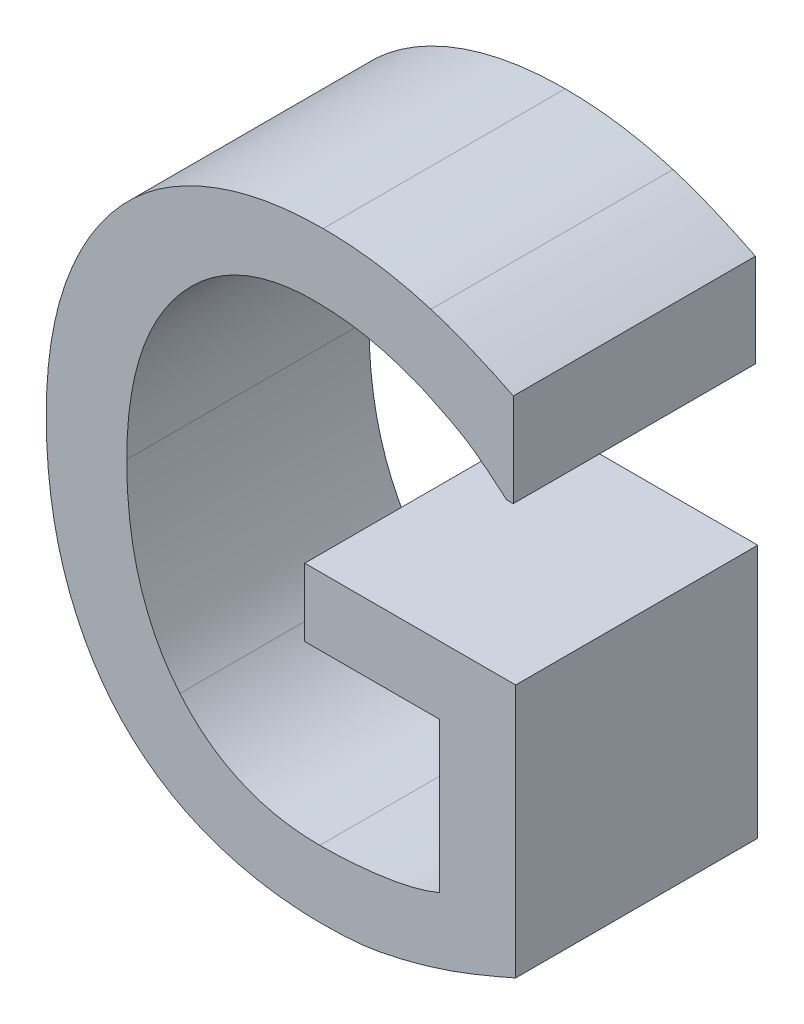
ISO-10303-21;
HEADER;
FILE_DESCRIPTION(('STEP AP214'),'2;1');
FILE_NAME('part.step','',(''),(''),'','','');
FILE_SCHEMA(('AUTOMOTIVE_DESIGN { 1 0 10303 214 1 1 1 1 }'));
ENDSEC;
DATA;
#1=APPLICATION_CONTEXT('core data for automotive mechanical design processes');
#2=APPLICATION_PROTOCOL_DEFINITION('international standard','automotive_design',2000,#1);
#3=PRODUCT_CONTEXT('',#1,'mechanical');
#4=PRODUCT('Part','Part','',(#3));
#5=PRODUCT_RELATED_PRODUCT_CATEGORY('part','',(#4));
#6=PRODUCT_DEFINITION_FORMATION('','',#4);
#7=PRODUCT_DEFINITION_CONTEXT('part definition',#1,'design');
#8=PRODUCT_DEFINITION('design','',#6,#7);
#9=PRODUCT_DEFINITION_SHAPE('','',#8);
#10=(LENGTH_UNIT() NAMED_UNIT(*) SI_UNIT(.MILLI.,.METRE.));
#11=(NAMED_UNIT(*) PLANE_ANGLE_UNIT() SI_UNIT($,.RADIAN.));
#12=(NAMED_UNIT(*) SI_UNIT($,.STERADIAN.) SOLID_ANGLE_UNIT());
#13=UNCERTAINTY_MEASURE_WITH_UNIT(LENGTH_MEASURE(1.E-05),#10,'distance_accuracy_value','');
#14=(GEOMETRIC_REPRESENTATION_CONTEXT(3) GLOBAL_UNCERTAINTY_ASSIGNED_CONTEXT((#13)) GLOBAL_UNIT_ASSIGNED_CONTEXT((#10,
#11,#12)) REPRESENTATION_CONTEXT('',''));
#15=CARTESIAN_POINT('',(0.,0.,0.));
#16=DIRECTION('',(0.,0.,1.));
#17=DIRECTION('',(1.,0.,0.));
#18=AXIS2_PLACEMENT_3D('',#15,#16,#17);
#19=CARTESIAN_POINT('',(-4.57632370667,-3.533902408114,0.));
#20=CARTESIAN_POINT('',(-4.57632370667,-3.533902408114,0.1));
#21=CARTESIAN_POINT('',(-4.57632370667,-3.564437254409,0.));
#22=CARTESIAN_POINT('',(-4.57632370667,-3.564437254409,0.1));
#23=CARTESIAN_POINT('',(-4.560181080921,-3.611503705385,0.));
#24=CARTESIAN_POINT('',(-4.560181080921,-3.611503705385,0.1));
#25=CARTESIAN_POINT('',(-4.545010902508,-3.627451841666,0.));
#26=CARTESIAN_POINT('',(-4.545010902508,-3.627451841666,0.1));
#27=B_SPLINE_SURFACE_WITH_KNOTS('',2,1,((#19,#20),(#21,#22),(#23,#24),(#25,#26)),.UNSPECIFIED.,
.F.,.F.,.F.,(3,1,3),(2,2),(-2.,-1.,0.),(0.,0.01),.UNSPECIFIED.);
#28=CARTESIAN_POINT('',(-4.545010902508,-3.627451841666,0.));
#29=CARTESIAN_POINT('',(-4.560181080921,-3.611503705385,0.));
#30=CARTESIAN_POINT('',(-4.57632370667,-3.564437254409,0.));
#31=CARTESIAN_POINT('',(-4.57632370667,-3.533902408114,0.));
#32=B_SPLINE_CURVE_WITH_KNOTS('',2,(#28,#29,#30,#31),.UNSPECIFIED.,.F.,.F.,(3,1,3),(0.,1.,2.),.UNSPECIFIED.);
#33=CARTESIAN_POINT('',(-4.545010902508,-3.627451841666,0.));
#34=VERTEX_POINT('',#33);
#35=CARTESIAN_POINT('',(-4.57632370667,-3.533902408114,0.));
#36=VERTEX_POINT('',#35);
#37=EDGE_CURVE('E11',#34,#36,#32,.T.);
#38=DIRECTION('',(0.,0.,1.));
#39=VECTOR('',#38,1.);
#40=CARTESIAN_POINT('',(-4.545010902508,-3.627451841666,0.));
#41=LINE('',#40,#39);
#42=CARTESIAN_POINT('',(-4.545010902508,-3.627451841666,0.1));
#43=VERTEX_POINT('',#42);
#44=EDGE_CURVE('E28',#34,#43,#41,.T.);
#45=CARTESIAN_POINT('',(-4.57632370667,-3.533902408114,0.1));
#46=CARTESIAN_POINT('',(-4.57632370667,-3.564437254409,0.1));
#47=CARTESIAN_POINT('',(-4.560181080921,-3.611503705385,0.1));
#48=CARTESIAN_POINT('',(-4.545010902508,-3.627451841666,0.1));
#49=B_SPLINE_CURVE_WITH_KNOTS('',2,(#45,#46,#47,#48),.UNSPECIFIED.,.F.,.F.,(3,1,3),(-2.,-1.,0.),.UNSPECIFIED.);
#50=CARTESIAN_POINT('',(-4.57632370667,-3.533902408114,0.1));
#51=VERTEX_POINT('',#50);
#52=EDGE_CURVE('E182',#51,#43,#49,.T.);
#53=DIRECTION('',(0.,0.,1.));
#54=VECTOR('',#53,1.);
#55=CARTESIAN_POINT('',(-4.57632370667,-3.533902408114,0.));
#56=LINE('',#55,#54);
#57=EDGE_CURVE('E454',#36,#51,#56,.T.);
#58=ORIENTED_EDGE('',*,*,#37,.F.);
#59=ORIENTED_EDGE('',*,*,#44,.T.);
#60=ORIENTED_EDGE('',*,*,#52,.F.);
#61=ORIENTED_EDGE('',*,*,#57,.F.);
#62=EDGE_LOOP('',(#58,#59,#60,#61));
#63=FACE_BOUND('',#62,.T.);
#64=ADVANCED_FACE('F17',(#63),#27,.T.);
#65=CARTESIAN_POINT('',(-4.544816413041,-3.442686848164,0.));
#66=CARTESIAN_POINT('',(-4.544816413041,-3.442686848164,0.1));
#67=CARTESIAN_POINT('',(-4.559986591455,-3.459023963379,0.));
#68=CARTESIAN_POINT('',(-4.559986591455,-3.459023963379,0.1));
#69=CARTESIAN_POINT('',(-4.57632370667,-3.504923477554,0.));
#70=CARTESIAN_POINT('',(-4.57632370667,-3.504923477554,0.1));
#71=CARTESIAN_POINT('',(-4.57632370667,-3.533902408114,0.));
#72=CARTESIAN_POINT('',(-4.57632370667,-3.533902408114,0.1));
#73=B_SPLINE_SURFACE_WITH_KNOTS('',2,1,((#65,#66),(#67,#68),(#69,#70),(#71,#72)),.UNSPECIFIED.,
.F.,.F.,.F.,(3,1,3),(2,2),(-2.,-1.,0.),(0.,0.01),.UNSPECIFIED.);
#74=CARTESIAN_POINT('',(-4.57632370667,-3.533902408114,0.));
#75=CARTESIAN_POINT('',(-4.57632370667,-3.504923477554,0.));
#76=CARTESIAN_POINT('',(-4.559986591455,-3.459023963379,0.));
#77=CARTESIAN_POINT('',(-4.544816413041,-3.442686848164,0.));
#78=B_SPLINE_CURVE_WITH_KNOTS('',2,(#74,#75,#76,#77),.UNSPECIFIED.,.F.,.F.,(3,1,3),(0.,1.,2.),.UNSPECIFIED.);
#79=CARTESIAN_POINT('',(-4.544816413041,-3.442686848164,0.));
#80=VERTEX_POINT('',#79);
#81=EDGE_CURVE('E447',#36,#80,#78,.T.);
#82=CARTESIAN_POINT('',(-4.544816413041,-3.442686848164,0.1));
#83=CARTESIAN_POINT('',(-4.559986591455,-3.459023963379,0.1));
#84=CARTESIAN_POINT('',(-4.57632370667,-3.504923477554,0.1));
#85=CARTESIAN_POINT('',(-4.57632370667,-3.533902408114,0.1));
#86=B_SPLINE_CURVE_WITH_KNOTS('',2,(#82,#83,#84,#85),.UNSPECIFIED.,.F.,.F.,(3,1,3),(-2.,-1.,0.),.UNSPECIFIED.);
#87=CARTESIAN_POINT('',(-4.544816413041,-3.442686848164,0.1));
#88=VERTEX_POINT('',#87);
#89=EDGE_CURVE('E443',#88,#51,#86,.T.);
#90=DIRECTION('',(0.,0.,1.));
#91=VECTOR('',#90,1.);
#92=CARTESIAN_POINT('',(-4.544816413041,-3.442686848164,0.));
#93=LINE('',#92,#91);
#94=EDGE_CURVE('E437',#80,#88,#93,.T.);
#95=ORIENTED_EDGE('',*,*,#81,.F.);
#96=ORIENTED_EDGE('',*,*,#57,.T.);
#97=ORIENTED_EDGE('',*,*,#89,.F.);
#98=ORIENTED_EDGE('',*,*,#94,.F.);
#99=EDGE_LOOP('',(#95,#96,#97,#98));
#100=FACE_BOUND('',#99,.T.);
#101=ADVANCED_FACE('F536',(#100),#73,.T.);
#102=CARTESIAN_POINT('',(-4.461963900165,-3.409818128267,0.));
#103=CARTESIAN_POINT('',(-4.461963900165,-3.409818128267,0.1));
#104=CARTESIAN_POINT('',(-4.487442020322,-3.409818128267,0.));
#105=CARTESIAN_POINT('',(-4.487442020322,-3.409818128267,0.1));
#106=CARTESIAN_POINT('',(-4.530229703027,-3.42693320135,0.));
#107=CARTESIAN_POINT('',(-4.530229703027,-3.42693320135,0.1));
#108=CARTESIAN_POINT('',(-4.544816413041,-3.442686848164,0.));
#109=CARTESIAN_POINT('',(-4.544816413041,-3.442686848164,0.1));
#110=B_SPLINE_SURFACE_WITH_KNOTS('',2,1,((#102,#103),(#104,#105),(#106,#107),(#108,#109)),
.UNSPECIFIED.,.F.,.F.,.F.,(3,1,3),(2,2),(-2.,-1.,0.),(0.,0.01),.UNSPECIFIED.);
#111=CARTESIAN_POINT('',(-4.544816413041,-3.442686848164,0.));
#112=CARTESIAN_POINT('',(-4.530229703027,-3.42693320135,0.));
#113=CARTESIAN_POINT('',(-4.487442020322,-3.409818128267,0.));
#114=CARTESIAN_POINT('',(-4.461963900165,-3.409818128267,0.));
#115=B_SPLINE_CURVE_WITH_KNOTS('',2,(#111,#112,#113,#114),.UNSPECIFIED.,.F.,.F.,(3,1,3),(0.,1.,
2.),.UNSPECIFIED.);
#116=CARTESIAN_POINT('',(-4.461963900165,-3.409818128267,0.));
#117=VERTEX_POINT('',#116);
#118=EDGE_CURVE('E430',#80,#117,#115,.T.);
#119=CARTESIAN_POINT('',(-4.461963900165,-3.409818128267,0.1));
#120=CARTESIAN_POINT('',(-4.487442020322,-3.409818128267,0.1));
#121=CARTESIAN_POINT('',(-4.530229703027,-3.42693320135,0.1));
#122=CARTESIAN_POINT('',(-4.544816413041,-3.442686848164,0.1));
#123=B_SPLINE_CURVE_WITH_KNOTS('',2,(#119,#120,#121,#122),.UNSPECIFIED.,.F.,.F.,(3,1,3),(-2.,
-1.,0.),.UNSPECIFIED.);
#124=CARTESIAN_POINT('',(-4.461963900165,-3.409818128267,0.1));
#125=VERTEX_POINT('',#124);
#126=EDGE_CURVE('E425',#125,#88,#123,.T.);
#127=DIRECTION('',(0.,0.,1.));
#128=VECTOR('',#127,1.);
#129=CARTESIAN_POINT('',(-4.461963900165,-3.409818128267,0.));
#130=LINE('',#129,#128);
#131=EDGE_CURVE('E419',#117,#125,#130,.T.);
#132=ORIENTED_EDGE('',*,*,#118,.F.);
#133=ORIENTED_EDGE('',*,*,#94,.T.);
#134=ORIENTED_EDGE('',*,*,#126,.F.);
#135=ORIENTED_EDGE('',*,*,#131,.F.);
#136=EDGE_LOOP('',(#132,#133,#134,#135));
#137=FACE_BOUND('',#136,.T.);
#138=ADVANCED_FACE('F532',(#137),#110,.T.);
#139=CARTESIAN_POINT('',(-4.417425812258,-3.41643077014,0.));
#140=CARTESIAN_POINT('',(-4.417425812258,-3.41643077014,0.1));
#141=CARTESIAN_POINT('',(-4.427539264533,-3.413318938671,0.));
#142=CARTESIAN_POINT('',(-4.427539264533,-3.413318938671,0.1));
#143=CARTESIAN_POINT('',(-4.449711063754,-3.409818128267,0.));
#144=CARTESIAN_POINT('',(-4.449711063754,-3.409818128267,0.1));
#145=CARTESIAN_POINT('',(-4.461963900165,-3.409818128267,0.));
#146=CARTESIAN_POINT('',(-4.461963900165,-3.409818128267,0.1));
#147=B_SPLINE_SURFACE_WITH_KNOTS('',2,1,((#139,#140),(#141,#142),(#143,#144),(#145,#146)),
.UNSPECIFIED.,.F.,.F.,.F.,(3,1,3),(2,2),(-2.,-1.,0.),(0.,0.01),.UNSPECIFIED.);
#148=CARTESIAN_POINT('',(-4.461963900165,-3.409818128267,0.));
#149=CARTESIAN_POINT('',(-4.449711063754,-3.409818128267,0.));
#150=CARTESIAN_POINT('',(-4.427539264533,-3.413318938671,0.));
#151=CARTESIAN_POINT('',(-4.417425812258,-3.41643077014,0.));
#152=B_SPLINE_CURVE_WITH_KNOTS('',2,(#148,#149,#150,#151),.UNSPECIFIED.,.F.,.F.,(3,1,3),(0.,1.,
2.),.UNSPECIFIED.);
#153=CARTESIAN_POINT('',(-4.417425812258,-3.41643077014,0.));
#154=VERTEX_POINT('',#153);
#155=EDGE_CURVE('E412',#117,#154,#152,.T.);
#156=CARTESIAN_POINT('',(-4.417425812258,-3.41643077014,0.1));
#157=CARTESIAN_POINT('',(-4.427539264533,-3.413318938671,0.1));
#158=CARTESIAN_POINT('',(-4.449711063754,-3.409818128267,0.1));
#159=CARTESIAN_POINT('',(-4.461963900165,-3.409818128267,0.1));
#160=B_SPLINE_CURVE_WITH_KNOTS('',2,(#156,#157,#158,#159),.UNSPECIFIED.,.F.,.F.,(3,1,3),(-2.,
-1.,0.),.UNSPECIFIED.);
#161=CARTESIAN_POINT('',(-4.417425812258,-3.41643077014,0.1));
#162=VERTEX_POINT('',#161);
#163=EDGE_CURVE('E407',#162,#125,#160,.T.);
#164=DIRECTION('',(0.,0.,1.));
#165=VECTOR('',#164,1.);
#166=CARTESIAN_POINT('',(-4.417425812258,-3.41643077014,0.));
#167=LINE('',#166,#165);
#168=EDGE_CURVE('E401',#154,#162,#167,.T.);
#169=ORIENTED_EDGE('',*,*,#155,.F.);
#170=ORIENTED_EDGE('',*,*,#131,.T.);
#171=ORIENTED_EDGE('',*,*,#163,.F.);
#172=ORIENTED_EDGE('',*,*,#168,.F.);
#173=EDGE_LOOP('',(#169,#170,#171,#172));
#174=FACE_BOUND('',#173,.T.);
#175=ADVANCED_FACE('F528',(#174),#147,.T.);
#176=CARTESIAN_POINT('',(-4.38339015556,-3.430434011753,0.));
#177=CARTESIAN_POINT('',(-4.38339015556,-3.430434011753,0.1));
#178=CARTESIAN_POINT('',(-4.389419329032,-3.427322180283,0.));
#179=CARTESIAN_POINT('',(-4.389419329032,-3.427322180283,0.1));
#180=CARTESIAN_POINT('',(-4.40925725465,-3.418764643742,0.));
#181=CARTESIAN_POINT('',(-4.40925725465,-3.418764643742,0.1));
#182=CARTESIAN_POINT('',(-4.417425812258,-3.41643077014,0.));
#183=CARTESIAN_POINT('',(-4.417425812258,-3.41643077014,0.1));
#184=B_SPLINE_SURFACE_WITH_KNOTS('',2,1,((#176,#177),(#178,#179),(#180,#181),(#182,#183)),
.UNSPECIFIED.,.F.,.F.,.F.,(3,1,3),(2,2),(-2.,-1.,0.),(0.,0.01),.UNSPECIFIED.);
#185=CARTESIAN_POINT('',(-4.417425812258,-3.41643077014,0.));
#186=CARTESIAN_POINT('',(-4.40925725465,-3.418764643742,0.));
#187=CARTESIAN_POINT('',(-4.389419329032,-3.427322180283,0.));
#188=CARTESIAN_POINT('',(-4.38339015556,-3.430434011753,0.));
#189=B_SPLINE_CURVE_WITH_KNOTS('',2,(#185,#186,#187,#188),.UNSPECIFIED.,.F.,.F.,(3,1,3),(0.,1.,
2.),.UNSPECIFIED.);
#190=CARTESIAN_POINT('',(-4.38339015556,-3.430434011753,0.));
#191=VERTEX_POINT('',#190);
#192=EDGE_CURVE('E394',#154,#191,#189,.T.);
#193=CARTESIAN_POINT('',(-4.38339015556,-3.430434011753,0.1));
#194=CARTESIAN_POINT('',(-4.389419329032,-3.427322180283,0.1));
#195=CARTESIAN_POINT('',(-4.40925725465,-3.418764643742,0.1));
#196=CARTESIAN_POINT('',(-4.417425812258,-3.41643077014,0.1));
#197=B_SPLINE_CURVE_WITH_KNOTS('',2,(#193,#194,#195,#196),.UNSPECIFIED.,.F.,.F.,(3,1,3),(-2.,
-1.,0.),.UNSPECIFIED.);
#198=CARTESIAN_POINT('',(-4.38339015556,-3.430434011753,0.1));
#199=VERTEX_POINT('',#198);
#200=EDGE_CURVE('E389',#199,#162,#197,.T.);
#201=DIRECTION('',(0.,0.,1.));
#202=VECTOR('',#201,1.);
#203=CARTESIAN_POINT('',(-4.38339015556,-3.430434011753,0.));
#204=LINE('',#203,#202);
#205=EDGE_CURVE('E386',#191,#199,#204,.T.);
#206=ORIENTED_EDGE('',*,*,#192,.F.);
#207=ORIENTED_EDGE('',*,*,#168,.T.);
#208=ORIENTED_EDGE('',*,*,#200,.F.);
#209=ORIENTED_EDGE('',*,*,#205,.F.);
#210=EDGE_LOOP('',(#206,#207,#208,#209));
#211=FACE_BOUND('',#210,.T.);
#212=ADVANCED_FACE('F524',(#211),#184,.T.);
#213=CARTESIAN_POINT('',(-4.38339015556,-3.468942926188,0.));
#214=DIRECTION('',(1.,0.,0.));
#215=DIRECTION('',(0.,1.,0.));
#216=AXIS2_PLACEMENT_3D('',#213,#214,#215);
#217=PLANE('',#216);
#218=DIRECTION('',(0.,-1.,0.));
#219=VECTOR('',#218,1.);
#220=CARTESIAN_POINT('',(-4.38339015556,-3.430434011753,0.));
#221=LINE('',#220,#219);
#222=CARTESIAN_POINT('',(-4.38339015556,-3.468942926188,0.));
#223=VERTEX_POINT('',#222);
#224=EDGE_CURVE('E384',#191,#223,#221,.T.);
#225=ORIENTED_EDGE('',*,*,#224,.F.);
#226=ORIENTED_EDGE('',*,*,#205,.T.);
#227=DIRECTION('',(0.,1.,0.));
#228=VECTOR('',#227,1.);
#229=CARTESIAN_POINT('',(-4.38339015556,-3.430434011753,0.1));
#230=LINE('',#229,#228);
#231=CARTESIAN_POINT('',(-4.38339015556,-3.468942926188,0.1));
#232=VERTEX_POINT('',#231);
#233=EDGE_CURVE('E381',#232,#199,#230,.T.);
#234=ORIENTED_EDGE('',*,*,#233,.F.);
#235=DIRECTION('',(0.,0.,1.));
#236=VECTOR('',#235,1.);
#237=CARTESIAN_POINT('',(-4.38339015556,-3.468942926188,0.));
#238=LINE('',#237,#236);
#239=EDGE_CURVE('E378',#223,#232,#238,.T.);
#240=ORIENTED_EDGE('',*,*,#239,.F.);
#241=EDGE_LOOP('',(#225,#226,#234,#240));
#242=FACE_BOUND('',#241,.T.);
#243=ADVANCED_FACE('F520',(#242),#217,.T.);
#244=CARTESIAN_POINT('',(-4.386113008096,-3.468942926188,0.));
#245=DIRECTION('',(0.,-1.,0.));
#246=DIRECTION('',(1.,0.,0.));
#247=AXIS2_PLACEMENT_3D('',#244,#245,#246);
#248=PLANE('',#247);
#249=DIRECTION('',(-1.,0.,0.));
#250=VECTOR('',#249,1.);
#251=CARTESIAN_POINT('',(-4.38339015556,-3.468942926188,0.));
#252=LINE('',#251,#250);
#253=CARTESIAN_POINT('',(-4.386113008096,-3.468942926188,0.));
#254=VERTEX_POINT('',#253);
#255=EDGE_CURVE('E376',#223,#254,#252,.T.);
#256=ORIENTED_EDGE('',*,*,#255,.F.);
#257=ORIENTED_EDGE('',*,*,#239,.T.);
#258=DIRECTION('',(1.,0.,0.));
#259=VECTOR('',#258,1.);
#260=CARTESIAN_POINT('',(-4.38339015556,-3.468942926188,0.1));
#261=LINE('',#260,#259);
#262=CARTESIAN_POINT('',(-4.386113008096,-3.468942926188,0.1));
#263=VERTEX_POINT('',#262);
#264=EDGE_CURVE('E373',#263,#232,#261,.T.);
#265=ORIENTED_EDGE('',*,*,#264,.F.);
#266=DIRECTION('',(0.,0.,1.));
#267=VECTOR('',#266,1.);
#268=CARTESIAN_POINT('',(-4.386113008096,-3.468942926188,0.));
#269=LINE('',#268,#267);
#270=EDGE_CURVE('E367',#254,#263,#269,.T.);
#271=ORIENTED_EDGE('',*,*,#270,.F.);
#272=EDGE_LOOP('',(#256,#257,#265,#271));
#273=FACE_BOUND('',#272,.T.);
#274=ADVANCED_FACE('F516',(#273),#248,.T.);
#275=CARTESIAN_POINT('',(-4.416453364923,-3.448716021636,0.));
#276=CARTESIAN_POINT('',(-4.416453364923,-3.448716021636,0.1));
#277=CARTESIAN_POINT('',(-4.404783996913,-3.454161726708,0.));
#278=CARTESIAN_POINT('',(-4.404783996913,-3.454161726708,0.1));
#279=CARTESIAN_POINT('',(-4.392142181568,-3.463691710583,0.));
#280=CARTESIAN_POINT('',(-4.392142181568,-3.463691710583,0.1));
#281=CARTESIAN_POINT('',(-4.386113008096,-3.468942926188,0.));
#282=CARTESIAN_POINT('',(-4.386113008096,-3.468942926188,0.1));
#283=B_SPLINE_SURFACE_WITH_KNOTS('',2,1,((#275,#276),(#277,#278),(#279,#280),(#281,#282)),
.UNSPECIFIED.,.F.,.F.,.F.,(3,1,3),(2,2),(-2.,-1.,0.),(0.,0.01),.UNSPECIFIED.);
#284=CARTESIAN_POINT('',(-4.386113008096,-3.468942926188,0.));
#285=CARTESIAN_POINT('',(-4.392142181568,-3.463691710583,0.));
#286=CARTESIAN_POINT('',(-4.404783996913,-3.454161726708,0.));
#287=CARTESIAN_POINT('',(-4.416453364923,-3.448716021636,0.));
#288=B_SPLINE_CURVE_WITH_KNOTS('',2,(#284,#285,#286,#287),.UNSPECIFIED.,.F.,.F.,(3,1,3),(0.,1.,
2.),.UNSPECIFIED.);
#289=CARTESIAN_POINT('',(-4.416453364923,-3.448716021636,0.));
#290=VERTEX_POINT('',#289);
#291=EDGE_CURVE('E360',#254,#290,#288,.T.);
#292=CARTESIAN_POINT('',(-4.416453364923,-3.448716021636,0.1));
#293=CARTESIAN_POINT('',(-4.404783996913,-3.454161726708,0.1));
#294=CARTESIAN_POINT('',(-4.392142181568,-3.463691710583,0.1));
#295=CARTESIAN_POINT('',(-4.386113008096,-3.468942926188,0.1));
#296=B_SPLINE_CURVE_WITH_KNOTS('',2,(#292,#293,#294,#295),.UNSPECIFIED.,.F.,.F.,(3,1,3),(-2.,
-1.,0.),.UNSPECIFIED.);
#297=CARTESIAN_POINT('',(-4.416453364923,-3.448716021636,0.1));
#298=VERTEX_POINT('',#297);
#299=EDGE_CURVE('E355',#298,#263,#296,.T.);
#300=DIRECTION('',(0.,0.,1.));
#301=VECTOR('',#300,1.);
#302=CARTESIAN_POINT('',(-4.416453364923,-3.448716021636,0.));
#303=LINE('',#302,#301);
#304=EDGE_CURVE('E349',#290,#298,#303,.T.);
#305=ORIENTED_EDGE('',*,*,#291,.F.);
#306=ORIENTED_EDGE('',*,*,#270,.T.);
#307=ORIENTED_EDGE('',*,*,#299,.F.);
#308=ORIENTED_EDGE('',*,*,#304,.F.);
#309=EDGE_LOOP('',(#305,#306,#307,#308));
#310=FACE_BOUND('',#309,.T.);
#311=ADVANCED_FACE('F512',(#310),#283,.T.);
#312=CARTESIAN_POINT('',(-4.465659200035,-3.437435632559,0.));
#313=CARTESIAN_POINT('',(-4.465659200035,-3.437435632559,0.1));
#314=CARTESIAN_POINT('',(-4.451266979488,-3.437435632559,0.));
#315=CARTESIAN_POINT('',(-4.451266979488,-3.437435632559,0.1));
#316=CARTESIAN_POINT('',(-4.426177838266,-3.443853784965,0.));
#317=CARTESIAN_POINT('',(-4.426177838266,-3.443853784965,0.1));
#318=CARTESIAN_POINT('',(-4.416453364923,-3.448716021636,0.));
#319=CARTESIAN_POINT('',(-4.416453364923,-3.448716021636,0.1));
#320=B_SPLINE_SURFACE_WITH_KNOTS('',2,1,((#312,#313),(#314,#315),(#316,#317),(#318,#319)),
.UNSPECIFIED.,.F.,.F.,.F.,(3,1,3),(2,2),(-2.,-1.,0.),(0.,0.01),.UNSPECIFIED.);
#321=CARTESIAN_POINT('',(-4.416453364923,-3.448716021636,0.));
#322=CARTESIAN_POINT('',(-4.426177838266,-3.443853784965,0.));
#323=CARTESIAN_POINT('',(-4.451266979488,-3.437435632559,0.));
#324=CARTESIAN_POINT('',(-4.465659200035,-3.437435632559,0.));
#325=B_SPLINE_CURVE_WITH_KNOTS('',2,(#321,#322,#323,#324),.UNSPECIFIED.,.F.,.F.,(3,1,3),(0.,1.,
2.),.UNSPECIFIED.);
#326=CARTESIAN_POINT('',(-4.465659200035,-3.437435632559,0.));
#327=VERTEX_POINT('',#326);
#328=EDGE_CURVE('E342',#290,#327,#325,.T.);
#329=CARTESIAN_POINT('',(-4.465659200035,-3.437435632559,0.1));
#330=CARTESIAN_POINT('',(-4.451266979488,-3.437435632559,0.1));
#331=CARTESIAN_POINT('',(-4.426177838266,-3.443853784965,0.1));
#332=CARTESIAN_POINT('',(-4.416453364923,-3.448716021636,0.1));
#333=B_SPLINE_CURVE_WITH_KNOTS('',2,(#329,#330,#331,#332),.UNSPECIFIED.,.F.,.F.,(3,1,3),(-2.,
-1.,0.),.UNSPECIFIED.);
#334=CARTESIAN_POINT('',(-4.465659200035,-3.437435632559,0.1));
#335=VERTEX_POINT('',#334);
#336=EDGE_CURVE('E337',#335,#298,#333,.T.);
#337=DIRECTION('',(0.,0.,1.));
#338=VECTOR('',#337,1.);
#339=CARTESIAN_POINT('',(-4.465659200035,-3.437435632559,0.));
#340=LINE('',#339,#338);
#341=EDGE_CURVE('E331',#327,#335,#340,.T.);
#342=ORIENTED_EDGE('',*,*,#328,.F.);
#343=ORIENTED_EDGE('',*,*,#304,.T.);
#344=ORIENTED_EDGE('',*,*,#336,.F.);
#345=ORIENTED_EDGE('',*,*,#341,.F.);
#346=EDGE_LOOP('',(#342,#343,#344,#345));
#347=FACE_BOUND('',#346,.T.);
#348=ADVANCED_FACE('F508',(#347),#320,.T.);
#349=CARTESIAN_POINT('',(-4.543066007839,-3.53292996078,0.));
#350=CARTESIAN_POINT('',(-4.543066007839,-3.53292996078,0.1));
#351=CARTESIAN_POINT('',(-4.543066007839,-3.489558809674,0.));
#352=CARTESIAN_POINT('',(-4.543066007839,-3.489558809674,0.1));
#353=CARTESIAN_POINT('',(-4.500278325133,-3.437435632559,0.));
#354=CARTESIAN_POINT('',(-4.500278325133,-3.437435632559,0.1));
#355=CARTESIAN_POINT('',(-4.465659200035,-3.437435632559,0.));
#356=CARTESIAN_POINT('',(-4.465659200035,-3.437435632559,0.1));
#357=B_SPLINE_SURFACE_WITH_KNOTS('',2,1,((#349,#350),(#351,#352),(#353,#354),(#355,#356)),
.UNSPECIFIED.,.F.,.F.,.F.,(3,1,3),(2,2),(-2.,-1.,0.),(0.,0.01),.UNSPECIFIED.);
#358=CARTESIAN_POINT('',(-4.465659200035,-3.437435632559,0.));
#359=CARTESIAN_POINT('',(-4.500278325133,-3.437435632559,0.));
#360=CARTESIAN_POINT('',(-4.543066007839,-3.489558809674,0.));
#361=CARTESIAN_POINT('',(-4.543066007839,-3.53292996078,0.));
#362=B_SPLINE_CURVE_WITH_KNOTS('',2,(#358,#359,#360,#361),.UNSPECIFIED.,.F.,.F.,(3,1,3),(0.,1.,
2.),.UNSPECIFIED.);
#363=CARTESIAN_POINT('',(-4.543066007839,-3.53292996078,0.));
#364=VERTEX_POINT('',#363);
#365=EDGE_CURVE('E324',#327,#364,#362,.T.);
#366=CARTESIAN_POINT('',(-4.543066007839,-3.53292996078,0.1));
#367=CARTESIAN_POINT('',(-4.543066007839,-3.489558809674,0.1));
#368=CARTESIAN_POINT('',(-4.500278325133,-3.437435632559,0.1));
#369=CARTESIAN_POINT('',(-4.465659200035,-3.437435632559,0.1));
#370=B_SPLINE_CURVE_WITH_KNOTS('',2,(#366,#367,#368,#369),.UNSPECIFIED.,.F.,.F.,(3,1,3),(-2.,
-1.,0.),.UNSPECIFIED.);
#371=CARTESIAN_POINT('',(-4.543066007839,-3.53292996078,0.1));
#372=VERTEX_POINT('',#371);
#373=EDGE_CURVE('E319',#372,#335,#370,.T.);
#374=DIRECTION('',(0.,0.,1.));
#375=VECTOR('',#374,1.);
#376=CARTESIAN_POINT('',(-4.543066007839,-3.53292996078,0.));
#377=LINE('',#376,#375);
#378=EDGE_CURVE('E313',#364,#372,#377,.T.);
#379=ORIENTED_EDGE('',*,*,#365,.F.);
#380=ORIENTED_EDGE('',*,*,#341,.T.);
#381=ORIENTED_EDGE('',*,*,#373,.F.);
#382=ORIENTED_EDGE('',*,*,#378,.F.);
#383=EDGE_LOOP('',(#379,#380,#381,#382));
#384=FACE_BOUND('',#383,.T.);
#385=ADVANCED_FACE('F504',(#384),#357,.T.);
#386=CARTESIAN_POINT('',(-4.521088698086,-3.60566902138,0.));
#387=CARTESIAN_POINT('',(-4.521088698086,-3.60566902138,0.1));
#388=CARTESIAN_POINT('',(-4.531785618762,-3.593221695502,0.));
#389=CARTESIAN_POINT('',(-4.531785618762,-3.593221695502,0.1));
#390=CARTESIAN_POINT('',(-4.543066007839,-3.557046654669,0.));
#391=CARTESIAN_POINT('',(-4.543066007839,-3.557046654669,0.1));
#392=CARTESIAN_POINT('',(-4.543066007839,-3.53292996078,0.));
#393=CARTESIAN_POINT('',(-4.543066007839,-3.53292996078,0.1));
#394=B_SPLINE_SURFACE_WITH_KNOTS('',2,1,((#386,#387),(#388,#389),(#390,#391),(#392,#393)),
.UNSPECIFIED.,.F.,.F.,.F.,(3,1,3),(2,2),(-2.,-1.,0.),(0.,0.01),.UNSPECIFIED.);
#395=CARTESIAN_POINT('',(-4.543066007839,-3.53292996078,0.));
#396=CARTESIAN_POINT('',(-4.543066007839,-3.557046654669,0.));
#397=CARTESIAN_POINT('',(-4.531785618762,-3.593221695502,0.));
#398=CARTESIAN_POINT('',(-4.521088698086,-3.60566902138,0.));
#399=B_SPLINE_CURVE_WITH_KNOTS('',2,(#395,#396,#397,#398),.UNSPECIFIED.,.F.,.F.,(3,1,3),(0.,1.,
2.),.UNSPECIFIED.);
#400=CARTESIAN_POINT('',(-4.521088698086,-3.60566902138,0.));
#401=VERTEX_POINT('',#400);
#402=EDGE_CURVE('E306',#364,#401,#399,.T.);
#403=CARTESIAN_POINT('',(-4.521088698086,-3.60566902138,0.1));
#404=CARTESIAN_POINT('',(-4.531785618762,-3.593221695502,0.1));
#405=CARTESIAN_POINT('',(-4.543066007839,-3.557046654669,0.1));
#406=CARTESIAN_POINT('',(-4.543066007839,-3.53292996078,0.1));
#407=B_SPLINE_CURVE_WITH_KNOTS('',2,(#403,#404,#405,#406),.UNSPECIFIED.,.F.,.F.,(3,1,3),(-2.,
-1.,0.),.UNSPECIFIED.);
#408=CARTESIAN_POINT('',(-4.521088698086,-3.60566902138,0.1));
#409=VERTEX_POINT('',#408);
#410=EDGE_CURVE('E301',#409,#372,#407,.T.);
#411=DIRECTION('',(0.,0.,1.));
#412=VECTOR('',#411,1.);
#413=CARTESIAN_POINT('',(-4.521088698086,-3.60566902138,0.));
#414=LINE('',#413,#412);
#415=EDGE_CURVE('E295',#401,#409,#414,.T.);
#416=ORIENTED_EDGE('',*,*,#402,.F.);
#417=ORIENTED_EDGE('',*,*,#378,.T.);
#418=ORIENTED_EDGE('',*,*,#410,.F.);
#419=ORIENTED_EDGE('',*,*,#415,.F.);
#420=EDGE_LOOP('',(#416,#417,#418,#419));
#421=FACE_BOUND('',#420,.T.);
#422=ADVANCED_FACE('F500',(#421),#394,.T.);
#423=CARTESIAN_POINT('',(-4.463325326433,-3.631147141536,0.));
#424=CARTESIAN_POINT('',(-4.463325326433,-3.631147141536,0.1));
#425=CARTESIAN_POINT('',(-4.481607336316,-3.631147141536,0.));
#426=CARTESIAN_POINT('',(-4.481607336316,-3.631147141536,0.1));
#427=CARTESIAN_POINT('',(-4.510780756343,-3.618116347258,0.));
#428=CARTESIAN_POINT('',(-4.510780756343,-3.618116347258,0.1));
#429=CARTESIAN_POINT('',(-4.521088698086,-3.60566902138,0.));
#430=CARTESIAN_POINT('',(-4.521088698086,-3.60566902138,0.1));
#431=B_SPLINE_SURFACE_WITH_KNOTS('',2,1,((#423,#424),(#425,#426),(#427,#428),(#429,#430)),
.UNSPECIFIED.,.F.,.F.,.F.,(3,1,3),(2,2),(-2.,-1.,0.),(0.,0.01),.UNSPECIFIED.);
#432=CARTESIAN_POINT('',(-4.521088698086,-3.60566902138,0.));
#433=CARTESIAN_POINT('',(-4.510780756343,-3.618116347258,0.));
#434=CARTESIAN_POINT('',(-4.481607336316,-3.631147141536,0.));
#435=CARTESIAN_POINT('',(-4.463325326433,-3.631147141536,0.));
#436=B_SPLINE_CURVE_WITH_KNOTS('',2,(#432,#433,#434,#435),.UNSPECIFIED.,.F.,.F.,(3,1,3),(0.,1.,
2.),.UNSPECIFIED.);
#437=CARTESIAN_POINT('',(-4.463325326433,-3.631147141536,0.));
#438=VERTEX_POINT('',#437);
#439=EDGE_CURVE('E288',#401,#438,#436,.T.);
#440=CARTESIAN_POINT('',(-4.463325326433,-3.631147141536,0.1));
#441=CARTESIAN_POINT('',(-4.481607336316,-3.631147141536,0.1));
#442=CARTESIAN_POINT('',(-4.510780756343,-3.618116347258,0.1));
#443=CARTESIAN_POINT('',(-4.521088698086,-3.60566902138,0.1));
#444=B_SPLINE_CURVE_WITH_KNOTS('',2,(#440,#441,#442,#443),.UNSPECIFIED.,.F.,.F.,(3,1,3),(-2.,
-1.,0.),.UNSPECIFIED.);
#445=CARTESIAN_POINT('',(-4.463325326433,-3.631147141536,0.1));
#446=VERTEX_POINT('',#445);
#447=EDGE_CURVE('E283',#446,#409,#444,.T.);
#448=DIRECTION('',(0.,0.,1.));
#449=VECTOR('',#448,1.);
#450=CARTESIAN_POINT('',(-4.463325326433,-3.631147141536,0.));
#451=LINE('',#450,#449);
#452=EDGE_CURVE('E277',#438,#446,#451,.T.);
#453=ORIENTED_EDGE('',*,*,#439,.F.);
#454=ORIENTED_EDGE('',*,*,#415,.T.);
#455=ORIENTED_EDGE('',*,*,#447,.F.);
#456=ORIENTED_EDGE('',*,*,#452,.F.);
#457=EDGE_LOOP('',(#453,#454,#455,#456));
#458=FACE_BOUND('',#457,.T.);
#459=ADVANCED_FACE('F496',(#458),#431,.T.);
#460=CARTESIAN_POINT('',(-4.413925001854,-3.623367562863,0.));
#461=CARTESIAN_POINT('',(-4.413925001854,-3.623367562863,0.1));
#462=CARTESIAN_POINT('',(-4.423066006796,-3.6272573522,0.));
#463=CARTESIAN_POINT('',(-4.423066006796,-3.6272573522,0.1));
#464=CARTESIAN_POINT('',(-4.449905553221,-3.631147141536,0.));
#465=CARTESIAN_POINT('',(-4.449905553221,-3.631147141536,0.1));
#466=CARTESIAN_POINT('',(-4.463325326433,-3.631147141536,0.));
#467=CARTESIAN_POINT('',(-4.463325326433,-3.631147141536,0.1));
#468=B_SPLINE_SURFACE_WITH_KNOTS('',2,1,((#460,#461),(#462,#463),(#464,#465),(#466,#467)),
.UNSPECIFIED.,.F.,.F.,.F.,(3,1,3),(2,2),(-2.,-1.,0.),(0.,0.01),.UNSPECIFIED.);
#469=CARTESIAN_POINT('',(-4.463325326433,-3.631147141536,0.));
#470=CARTESIAN_POINT('',(-4.449905553221,-3.631147141536,0.));
#471=CARTESIAN_POINT('',(-4.423066006796,-3.6272573522,0.));
#472=CARTESIAN_POINT('',(-4.413925001854,-3.623367562863,0.));
#473=B_SPLINE_CURVE_WITH_KNOTS('',2,(#469,#470,#471,#472),.UNSPECIFIED.,.F.,.F.,(3,1,3),(0.,1.,
2.),.UNSPECIFIED.);
#474=CARTESIAN_POINT('',(-4.413925001854,-3.623367562863,0.));
#475=VERTEX_POINT('',#474);
#476=EDGE_CURVE('E270',#438,#475,#473,.T.);
#477=CARTESIAN_POINT('',(-4.413925001854,-3.623367562863,0.1));
#478=CARTESIAN_POINT('',(-4.423066006796,-3.6272573522,0.1));
#479=CARTESIAN_POINT('',(-4.449905553221,-3.631147141536,0.1));
#480=CARTESIAN_POINT('',(-4.463325326433,-3.631147141536,0.1));
#481=B_SPLINE_CURVE_WITH_KNOTS('',2,(#477,#478,#479,#480),.UNSPECIFIED.,.F.,.F.,(3,1,3),(-2.,
-1.,0.),.UNSPECIFIED.);
#482=CARTESIAN_POINT('',(-4.413925001854,-3.623367562863,0.1));
#483=VERTEX_POINT('',#482);
#484=EDGE_CURVE('E265',#483,#446,#481,.T.);
#485=DIRECTION('',(0.,0.,1.));
#486=VECTOR('',#485,1.);
#487=CARTESIAN_POINT('',(-4.413925001854,-3.623367562863,0.));
#488=LINE('',#487,#486);
#489=EDGE_CURVE('E262',#475,#483,#488,.T.);
#490=ORIENTED_EDGE('',*,*,#476,.F.);
#491=ORIENTED_EDGE('',*,*,#452,.T.);
#492=ORIENTED_EDGE('',*,*,#484,.F.);
#493=ORIENTED_EDGE('',*,*,#489,.F.);
#494=EDGE_LOOP('',(#490,#491,#492,#493));
#495=FACE_BOUND('',#494,.T.);
#496=ADVANCED_FACE('F492',(#495),#468,.T.);
#497=CARTESIAN_POINT('',(-4.413925001854,-3.561325422939,0.));
#498=DIRECTION('',(-1.,0.,0.));
#499=DIRECTION('',(0.,-1.,0.));
#500=AXIS2_PLACEMENT_3D('',#497,#498,#499);
#501=PLANE('',#500);
#502=DIRECTION('',(0.,1.,0.));
#503=VECTOR('',#502,1.);
#504=CARTESIAN_POINT('',(-4.413925001854,-3.623367562863,0.));
#505=LINE('',#504,#503);
#506=CARTESIAN_POINT('',(-4.413925001854,-3.561325422939,0.));
#507=VERTEX_POINT('',#506);
#508=EDGE_CURVE('E260',#475,#507,#505,.T.);
#509=ORIENTED_EDGE('',*,*,#508,.F.);
#510=ORIENTED_EDGE('',*,*,#489,.T.);
#511=DIRECTION('',(0.,-1.,0.));
#512=VECTOR('',#511,1.);
#513=CARTESIAN_POINT('',(-4.413925001854,-3.623367562863,0.1));
#514=LINE('',#513,#512);
#515=CARTESIAN_POINT('',(-4.413925001854,-3.561325422939,0.1));
#516=VERTEX_POINT('',#515);
#517=EDGE_CURVE('E257',#516,#483,#514,.T.);
#518=ORIENTED_EDGE('',*,*,#517,.F.);
#519=DIRECTION('',(0.,0.,1.));
#520=VECTOR('',#519,1.);
#521=CARTESIAN_POINT('',(-4.413925001854,-3.561325422939,0.));
#522=LINE('',#521,#520);
#523=EDGE_CURVE('E254',#507,#516,#522,.T.);
#524=ORIENTED_EDGE('',*,*,#523,.F.);
#525=EDGE_LOOP('',(#509,#510,#518,#524));
#526=FACE_BOUND('',#525,.T.);
#527=ADVANCED_FACE('F488',(#526),#501,.T.);
#528=CARTESIAN_POINT('',(-4.469548989372,-3.561325422939,0.));
#529=DIRECTION('',(0.,-1.,0.));
#530=DIRECTION('',(1.,0.,0.));
#531=AXIS2_PLACEMENT_3D('',#528,#529,#530);
#532=PLANE('',#531);
#533=DIRECTION('',(-1.,0.,0.));
#534=VECTOR('',#533,1.);
#535=CARTESIAN_POINT('',(-4.413925001854,-3.561325422939,0.));
#536=LINE('',#535,#534);
#537=CARTESIAN_POINT('',(-4.469548989372,-3.561325422939,0.));
#538=VERTEX_POINT('',#537);
#539=EDGE_CURVE('E252',#507,#538,#536,.T.);
#540=ORIENTED_EDGE('',*,*,#539,.F.);
#541=ORIENTED_EDGE('',*,*,#523,.T.);
#542=DIRECTION('',(1.,0.,0.));
#543=VECTOR('',#542,1.);
#544=CARTESIAN_POINT('',(-4.413925001854,-3.561325422939,0.1));
#545=LINE('',#544,#543);
#546=CARTESIAN_POINT('',(-4.469548989372,-3.561325422939,0.1));
#547=VERTEX_POINT('',#546);
#548=EDGE_CURVE('E249',#547,#516,#545,.T.);
#549=ORIENTED_EDGE('',*,*,#548,.F.);
#550=DIRECTION('',(0.,0.,1.));
#551=VECTOR('',#550,1.);
#552=CARTESIAN_POINT('',(-4.469548989372,-3.561325422939,0.));
#553=LINE('',#552,#551);
#554=EDGE_CURVE('E246',#538,#547,#553,.T.);
#555=ORIENTED_EDGE('',*,*,#554,.F.);
#556=EDGE_LOOP('',(#540,#541,#549,#555));
#557=FACE_BOUND('',#556,.T.);
#558=ADVANCED_FACE('F484',(#557),#532,.T.);
#559=CARTESIAN_POINT('',(-4.469548989372,-3.533318939714,0.));
#560=DIRECTION('',(-1.,0.,0.));
#561=DIRECTION('',(0.,-1.,0.));
#562=AXIS2_PLACEMENT_3D('',#559,#560,#561);
#563=PLANE('',#562);
#564=DIRECTION('',(0.,1.,0.));
#565=VECTOR('',#564,1.);
#566=CARTESIAN_POINT('',(-4.469548989372,-3.561325422939,0.));
#567=LINE('',#566,#565);
#568=CARTESIAN_POINT('',(-4.469548989372,-3.533318939714,0.));
#569=VERTEX_POINT('',#568);
#570=EDGE_CURVE('E244',#538,#569,#567,.T.);
#571=ORIENTED_EDGE('',*,*,#570,.F.);
#572=ORIENTED_EDGE('',*,*,#554,.T.);
#573=DIRECTION('',(0.,-1.,0.));
#574=VECTOR('',#573,1.);
#575=CARTESIAN_POINT('',(-4.469548989372,-3.561325422939,0.1));
#576=LINE('',#575,#574);
#577=CARTESIAN_POINT('',(-4.469548989372,-3.533318939714,0.1));
#578=VERTEX_POINT('',#577);
#579=EDGE_CURVE('E241',#578,#547,#576,.T.);
#580=ORIENTED_EDGE('',*,*,#579,.F.);
#581=DIRECTION('',(0.,0.,1.));
#582=VECTOR('',#581,1.);
#583=CARTESIAN_POINT('',(-4.469548989372,-3.533318939714,0.));
#584=LINE('',#583,#582);
#585=EDGE_CURVE('E238',#569,#578,#584,.T.);
#586=ORIENTED_EDGE('',*,*,#585,.F.);
#587=EDGE_LOOP('',(#571,#572,#580,#586));
#588=FACE_BOUND('',#587,.T.);
#589=ADVANCED_FACE('F480',(#588),#563,.T.);
#590=CARTESIAN_POINT('',(-4.382417708226,-3.533318939714,0.));
#591=DIRECTION('',(0.,1.,0.));
#592=DIRECTION('',(-1.,0.,0.));
#593=AXIS2_PLACEMENT_3D('',#590,#591,#592);
#594=PLANE('',#593);
#595=DIRECTION('',(1.,0.,0.));
#596=VECTOR('',#595,1.);
#597=CARTESIAN_POINT('',(-4.469548989372,-3.533318939714,0.));
#598=LINE('',#597,#596);
#599=CARTESIAN_POINT('',(-4.382417708226,-3.533318939714,0.));
#600=VERTEX_POINT('',#599);
#601=EDGE_CURVE('E236',#569,#600,#598,.T.);
#602=ORIENTED_EDGE('',*,*,#601,.F.);
#603=ORIENTED_EDGE('',*,*,#585,.T.);
#604=DIRECTION('',(-1.,0.,0.));
#605=VECTOR('',#604,1.);
#606=CARTESIAN_POINT('',(-4.469548989372,-3.533318939714,0.1));
#607=LINE('',#606,#605);
#608=CARTESIAN_POINT('',(-4.382417708226,-3.533318939714,0.1));
#609=VERTEX_POINT('',#608);
#610=EDGE_CURVE('E233',#609,#578,#607,.T.);
#611=ORIENTED_EDGE('',*,*,#610,.F.);
#612=DIRECTION('',(0.,0.,1.));
#613=VECTOR('',#612,1.);
#614=CARTESIAN_POINT('',(-4.382417708226,-3.533318939714,0.));
#615=LINE('',#614,#613);
#616=EDGE_CURVE('E230',#600,#609,#615,.T.);
#617=ORIENTED_EDGE('',*,*,#616,.F.);
#618=EDGE_LOOP('',(#602,#603,#611,#617));
#619=FACE_BOUND('',#618,.T.);
#620=ADVANCED_FACE('F476',(#619),#594,.T.);
#621=CARTESIAN_POINT('',(-4.382417708226,-3.638148762343,0.));
#622=DIRECTION('',(1.,0.,0.));
#623=DIRECTION('',(0.,1.,0.));
#624=AXIS2_PLACEMENT_3D('',#621,#622,#623);
#625=PLANE('',#624);
#626=DIRECTION('',(0.,-1.,0.));
#627=VECTOR('',#626,1.);
#628=CARTESIAN_POINT('',(-4.382417708226,-3.533318939714,0.));
#629=LINE('',#628,#627);
#630=CARTESIAN_POINT('',(-4.382417708226,-3.638148762343,0.));
#631=VERTEX_POINT('',#630);
#632=EDGE_CURVE('E228',#600,#631,#629,.T.);
#633=ORIENTED_EDGE('',*,*,#632,.F.);
#634=ORIENTED_EDGE('',*,*,#616,.T.);
#635=DIRECTION('',(0.,1.,0.));
#636=VECTOR('',#635,1.);
#637=CARTESIAN_POINT('',(-4.382417708226,-3.533318939714,0.1));
#638=LINE('',#637,#636);
#639=CARTESIAN_POINT('',(-4.382417708226,-3.638148762343,0.1));
#640=VERTEX_POINT('',#639);
#641=EDGE_CURVE('E225',#640,#609,#638,.T.);
#642=ORIENTED_EDGE('',*,*,#641,.F.);
#643=DIRECTION('',(0.,0.,1.));
#644=VECTOR('',#643,1.);
#645=CARTESIAN_POINT('',(-4.382417708226,-3.638148762343,0.));
#646=LINE('',#645,#644);
#647=EDGE_CURVE('E219',#631,#640,#646,.T.);
#648=ORIENTED_EDGE('',*,*,#647,.F.);
#649=EDGE_LOOP('',(#633,#634,#642,#648));
#650=FACE_BOUND('',#649,.T.);
#651=ADVANCED_FACE('F472',(#650),#625,.T.);
#652=CARTESIAN_POINT('',(-4.417814791191,-3.651763025022,0.));
#653=CARTESIAN_POINT('',(-4.417814791191,-3.651763025022,0.1));
#654=CARTESIAN_POINT('',(-4.409062765183,-3.649234661953,0.));
#655=CARTESIAN_POINT('',(-4.409062765183,-3.649234661953,0.1));
#656=CARTESIAN_POINT('',(-4.388446881698,-3.640871614879,0.));
#657=CARTESIAN_POINT('',(-4.388446881698,-3.640871614879,0.1));
#658=CARTESIAN_POINT('',(-4.382417708226,-3.638148762343,0.));
#659=CARTESIAN_POINT('',(-4.382417708226,-3.638148762343,0.1));
#660=B_SPLINE_SURFACE_WITH_KNOTS('',2,1,((#652,#653),(#654,#655),(#656,#657),(#658,#659)),
.UNSPECIFIED.,.F.,.F.,.F.,(3,1,3),(2,2),(-2.,-1.,0.),(0.,0.01),.UNSPECIFIED.);
#661=CARTESIAN_POINT('',(-4.382417708226,-3.638148762343,0.));
#662=CARTESIAN_POINT('',(-4.388446881698,-3.640871614879,0.));
#663=CARTESIAN_POINT('',(-4.409062765183,-3.649234661953,0.));
#664=CARTESIAN_POINT('',(-4.417814791191,-3.651763025022,0.));
#665=B_SPLINE_CURVE_WITH_KNOTS('',2,(#661,#662,#663,#664),.UNSPECIFIED.,.F.,.F.,(3,1,3),(0.,1.,
2.),.UNSPECIFIED.);
#666=CARTESIAN_POINT('',(-4.417814791191,-3.651763025022,0.));
#667=VERTEX_POINT('',#666);
#668=EDGE_CURVE('E212',#631,#667,#665,.T.);
#669=CARTESIAN_POINT('',(-4.417814791191,-3.651763025022,0.1));
#670=CARTESIAN_POINT('',(-4.409062765183,-3.649234661953,0.1));
#671=CARTESIAN_POINT('',(-4.388446881698,-3.640871614879,0.1));
#672=CARTESIAN_POINT('',(-4.382417708226,-3.638148762343,0.1));
#673=B_SPLINE_CURVE_WITH_KNOTS('',2,(#669,#670,#671,#672),.UNSPECIFIED.,.F.,.F.,(3,1,3),(-2.,
-1.,0.),.UNSPECIFIED.);
#674=CARTESIAN_POINT('',(-4.417814791191,-3.651763025022,0.1));
#675=VERTEX_POINT('',#674);
#676=EDGE_CURVE('E208',#675,#640,#673,.T.);
#677=DIRECTION('',(0.,0.,1.));
#678=VECTOR('',#677,1.);
#679=CARTESIAN_POINT('',(-4.417814791191,-3.651763025022,0.));
#680=LINE('',#679,#678);
#681=EDGE_CURVE('E167',#667,#675,#680,.T.);
#682=ORIENTED_EDGE('',*,*,#668,.F.);
#683=ORIENTED_EDGE('',*,*,#647,.T.);
#684=ORIENTED_EDGE('',*,*,#676,.F.);
#685=ORIENTED_EDGE('',*,*,#681,.F.);
#686=EDGE_LOOP('',(#682,#683,#684,#685));
#687=FACE_BOUND('',#686,.T.);
#688=ADVANCED_FACE('F470',(#687),#660,.T.);
#689=CARTESIAN_POINT('',(-4.462158389632,-3.658764645828,0.));
#690=CARTESIAN_POINT('',(-4.462158389632,-3.658764645828,0.1));
#691=CARTESIAN_POINT('',(-4.44873861642,-3.658764645828,0.));
#692=CARTESIAN_POINT('',(-4.44873861642,-3.658764645828,0.1));
#693=CARTESIAN_POINT('',(-4.429678648669,-3.655263835425,0.));
#694=CARTESIAN_POINT('',(-4.429678648669,-3.655263835425,0.1));
#695=CARTESIAN_POINT('',(-4.417814791191,-3.651763025022,0.));
#696=CARTESIAN_POINT('',(-4.417814791191,-3.651763025022,0.1));
#697=B_SPLINE_SURFACE_WITH_KNOTS('',2,1,((#689,#690),(#691,#692),(#693,#694),(#695,#696)),
.UNSPECIFIED.,.F.,.F.,.F.,(3,1,3),(2,2),(-2.,-1.,0.),(0.,0.01),.UNSPECIFIED.);
#698=CARTESIAN_POINT('',(-4.417814791191,-3.651763025022,0.));
#699=CARTESIAN_POINT('',(-4.429678648669,-3.655263835425,0.));
#700=CARTESIAN_POINT('',(-4.44873861642,-3.658764645828,0.));
#701=CARTESIAN_POINT('',(-4.462158389632,-3.658764645828,0.));
#702=B_SPLINE_CURVE_WITH_KNOTS('',2,(#698,#699,#700,#701),.UNSPECIFIED.,.F.,.F.,(3,1,3),(0.,1.,
2.),.UNSPECIFIED.);
#703=CARTESIAN_POINT('',(-4.462158389632,-3.658764645828,0.));
#704=VERTEX_POINT('',#703);
#705=EDGE_CURVE('E171',#667,#704,#702,.T.);
#706=CARTESIAN_POINT('',(-4.462158389632,-3.658764645828,0.1));
#707=CARTESIAN_POINT('',(-4.44873861642,-3.658764645828,0.1));
#708=CARTESIAN_POINT('',(-4.429678648669,-3.655263835425,0.1));
#709=CARTESIAN_POINT('',(-4.417814791191,-3.651763025022,0.1));
#710=B_SPLINE_CURVE_WITH_KNOTS('',2,(#706,#707,#708,#709),.UNSPECIFIED.,.F.,.F.,(3,1,3),(-2.,
-1.,0.),.UNSPECIFIED.);
#711=CARTESIAN_POINT('',(-4.462158389632,-3.658764645828,0.1));
#712=VERTEX_POINT('',#711);
#713=EDGE_CURVE('E160',#712,#675,#710,.T.);
#714=DIRECTION('',(0.,0.,1.));
#715=VECTOR('',#714,1.);
#716=CARTESIAN_POINT('',(-4.462158389632,-3.658764645828,0.));
#717=LINE('',#716,#715);
#718=EDGE_CURVE('E164',#704,#712,#717,.T.);
#719=ORIENTED_EDGE('',*,*,#705,.F.);
#720=ORIENTED_EDGE('',*,*,#681,.T.);
#721=ORIENTED_EDGE('',*,*,#713,.F.);
#722=ORIENTED_EDGE('',*,*,#718,.F.);
#723=EDGE_LOOP('',(#719,#720,#721,#722));
#724=FACE_BOUND('',#723,.T.);
#725=ADVANCED_FACE('F163',(#724),#697,.T.);
#726=CARTESIAN_POINT('',(-4.545010902508,-3.627451841666,0.));
#727=CARTESIAN_POINT('',(-4.545010902508,-3.627451841666,0.1));
#728=CARTESIAN_POINT('',(-4.529840724094,-3.643205488481,0.));
#729=CARTESIAN_POINT('',(-4.529840724094,-3.643205488481,0.1));
#730=CARTESIAN_POINT('',(-4.487636509788,-3.658764645828,0.));
#731=CARTESIAN_POINT('',(-4.487636509788,-3.658764645828,0.1));
#732=CARTESIAN_POINT('',(-4.462158389632,-3.658764645828,0.));
#733=CARTESIAN_POINT('',(-4.462158389632,-3.658764645828,0.1));
#734=B_SPLINE_SURFACE_WITH_KNOTS('',2,1,((#726,#727),(#728,#729),(#730,#731),(#732,#733)),
.UNSPECIFIED.,.F.,.F.,.F.,(3,1,3),(2,2),(-2.,-1.,0.),(0.,0.01),.UNSPECIFIED.);
#735=CARTESIAN_POINT('',(-4.462158389632,-3.658764645828,0.));
#736=CARTESIAN_POINT('',(-4.487636509788,-3.658764645828,0.));
#737=CARTESIAN_POINT('',(-4.529840724094,-3.643205488481,0.));
#738=CARTESIAN_POINT('',(-4.545010902508,-3.627451841666,0.));
#739=B_SPLINE_CURVE_WITH_KNOTS('',2,(#735,#736,#737,#738),.UNSPECIFIED.,.F.,.F.,(3,1,3),(0.,1.,
2.),.UNSPECIFIED.);
#740=EDGE_CURVE('E177',#704,#34,#739,.T.);
#741=CARTESIAN_POINT('',(-4.545010902508,-3.627451841666,0.1));
#742=CARTESIAN_POINT('',(-4.529840724094,-3.643205488481,0.1));
#743=CARTESIAN_POINT('',(-4.487636509788,-3.658764645828,0.1));
#744=CARTESIAN_POINT('',(-4.462158389632,-3.658764645828,0.1));
#745=B_SPLINE_CURVE_WITH_KNOTS('',2,(#741,#742,#743,#744),.UNSPECIFIED.,.F.,.F.,(3,1,3),(-2.,
-1.,0.),.UNSPECIFIED.);
#746=EDGE_CURVE('E176',#43,#712,#745,.T.);
#747=ORIENTED_EDGE('',*,*,#740,.F.);
#748=ORIENTED_EDGE('',*,*,#718,.T.);
#749=ORIENTED_EDGE('',*,*,#746,.F.);
#750=ORIENTED_EDGE('',*,*,#44,.F.);
#751=EDGE_LOOP('',(#747,#748,#749,#750));
#752=FACE_BOUND('',#751,.T.);
#753=ADVANCED_FACE('F175',(#752),#734,.T.);
#754=CARTESIAN_POINT('',(-4.467738429925,-3.539340959895,0.));
#755=DIRECTION('',(0.,0.,1.));
#756=DIRECTION('',(1.,0.,0.));
#757=AXIS2_PLACEMENT_3D('',#754,#755,#756);
#758=PLANE('',#757);
#759=ORIENTED_EDGE('',*,*,#740,.T.);
#760=ORIENTED_EDGE('',*,*,#37,.T.);
#761=ORIENTED_EDGE('',*,*,#81,.T.);
#762=ORIENTED_EDGE('',*,*,#118,.T.);
#763=ORIENTED_EDGE('',*,*,#155,.T.);
#764=ORIENTED_EDGE('',*,*,#192,.T.);
#765=ORIENTED_EDGE('',*,*,#224,.T.);
#766=ORIENTED_EDGE('',*,*,#255,.T.);
#767=ORIENTED_EDGE('',*,*,#291,.T.);
#768=ORIENTED_EDGE('',*,*,#328,.T.);
#769=ORIENTED_EDGE('',*,*,#365,.T.);
#770=ORIENTED_EDGE('',*,*,#402,.T.);
#771=ORIENTED_EDGE('',*,*,#439,.T.);
#772=ORIENTED_EDGE('',*,*,#476,.T.);
#773=ORIENTED_EDGE('',*,*,#508,.T.);
#774=ORIENTED_EDGE('',*,*,#539,.T.);
#775=ORIENTED_EDGE('',*,*,#570,.T.);
#776=ORIENTED_EDGE('',*,*,#601,.T.);
#777=ORIENTED_EDGE('',*,*,#632,.T.);
#778=ORIENTED_EDGE('',*,*,#668,.T.);
#779=ORIENTED_EDGE('',*,*,#705,.T.);
#780=EDGE_LOOP('',(#759,#760,#761,#762,#763,#764,#765,#766,#767,#768,#769,#770,#771,#772,#773,
#774,#775,#776,#777,#778,#779));
#781=FACE_BOUND('',#780,.T.);
#782=ADVANCED_FACE('F465',(#781),#758,.F.);
#783=CARTESIAN_POINT('',(-4.467738429925,-3.539340959895,0.1));
#784=DIRECTION('',(0.,0.,1.));
#785=DIRECTION('',(1.,0.,0.));
#786=AXIS2_PLACEMENT_3D('',#783,#784,#785);
#787=PLANE('',#786);
#788=ORIENTED_EDGE('',*,*,#746,.T.);
#789=ORIENTED_EDGE('',*,*,#713,.T.);
#790=ORIENTED_EDGE('',*,*,#676,.T.);
#791=ORIENTED_EDGE('',*,*,#641,.T.);
#792=ORIENTED_EDGE('',*,*,#610,.T.);
#793=ORIENTED_EDGE('',*,*,#579,.T.);
#794=ORIENTED_EDGE('',*,*,#548,.T.);
#795=ORIENTED_EDGE('',*,*,#517,.T.);
#796=ORIENTED_EDGE('',*,*,#484,.T.);
#797=ORIENTED_EDGE('',*,*,#447,.T.);
#798=ORIENTED_EDGE('',*,*,#410,.T.);
#799=ORIENTED_EDGE('',*,*,#373,.T.);
#800=ORIENTED_EDGE('',*,*,#336,.T.);
#801=ORIENTED_EDGE('',*,*,#299,.T.);
#802=ORIENTED_EDGE('',*,*,#264,.T.);
#803=ORIENTED_EDGE('',*,*,#233,.T.);
#804=ORIENTED_EDGE('',*,*,#200,.T.);
#805=ORIENTED_EDGE('',*,*,#163,.T.);
#806=ORIENTED_EDGE('',*,*,#126,.T.);
#807=ORIENTED_EDGE('',*,*,#89,.T.);
#808=ORIENTED_EDGE('',*,*,#52,.T.);
#809=EDGE_LOOP('',(#788,#789,#790,#791,#792,#793,#794,#795,#796,#797,#798,#799,#800,#801,#802,
#803,#804,#805,#806,#807,#808));
#810=FACE_BOUND('',#809,.T.);
#811=ADVANCED_FACE('F180',(#810),#787,.T.);
#812=CLOSED_SHELL('',(#64,#101,#138,#175,#212,#243,#274,#311,#348,#385,#422,#459,#496,#527,#558,
#589,#620,#651,#688,#725,#753,#782,#811));
#813=MANIFOLD_SOLID_BREP('B1',#812);
#814=ADVANCED_BREP_SHAPE_REPRESENTATION('',(#18,#813),#14);
#815=SHAPE_DEFINITION_REPRESENTATION(#9,#814);
ENDSEC;
END-ISO-10303-21;
